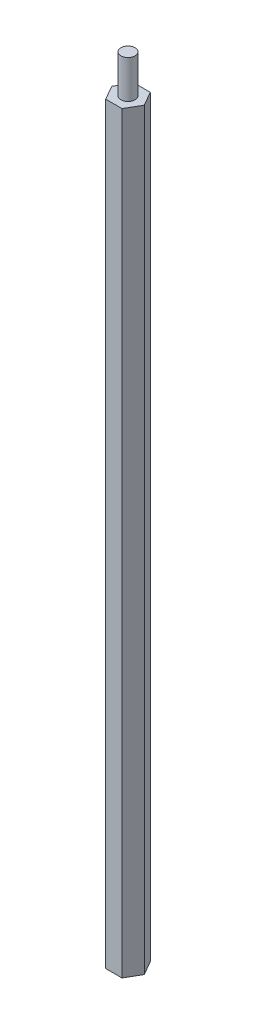
ISO-10303-21;
HEADER;
FILE_DESCRIPTION(('STEP AP214'),'2;1');
FILE_NAME('part.step','',(''),(''),'','','');
FILE_SCHEMA(('AUTOMOTIVE_DESIGN { 1 0 10303 214 1 1 1 1 }'));
ENDSEC;
DATA;
#1=APPLICATION_CONTEXT('core data for automotive mechanical design processes');
#2=APPLICATION_PROTOCOL_DEFINITION('international standard','automotive_design',2000,#1);
#3=PRODUCT_CONTEXT('',#1,'mechanical');
#4=PRODUCT('Part','Part','',(#3));
#5=PRODUCT_RELATED_PRODUCT_CATEGORY('part','',(#4));
#6=PRODUCT_DEFINITION_FORMATION('','',#4);
#7=PRODUCT_DEFINITION_CONTEXT('part definition',#1,'design');
#8=PRODUCT_DEFINITION('design','',#6,#7);
#9=PRODUCT_DEFINITION_SHAPE('','',#8);
#10=(LENGTH_UNIT() NAMED_UNIT(*) SI_UNIT(.MILLI.,.METRE.));
#11=(NAMED_UNIT(*) PLANE_ANGLE_UNIT() SI_UNIT($,.RADIAN.));
#12=(NAMED_UNIT(*) SI_UNIT($,.STERADIAN.) SOLID_ANGLE_UNIT());
#13=UNCERTAINTY_MEASURE_WITH_UNIT(LENGTH_MEASURE(1.E-05),#10,'distance_accuracy_value','');
#14=(GEOMETRIC_REPRESENTATION_CONTEXT(3) GLOBAL_UNCERTAINTY_ASSIGNED_CONTEXT((#13)) GLOBAL_UNIT_ASSIGNED_CONTEXT((#10,
#11,#12)) REPRESENTATION_CONTEXT('',''));
#15=CARTESIAN_POINT('',(0.,0.,0.));
#16=DIRECTION('',(0.,0.,1.));
#17=DIRECTION('',(1.,0.,0.));
#18=AXIS2_PLACEMENT_3D('',#15,#16,#17);
#19=CARTESIAN_POINT('',(-1.73205080756888,160.,-3.));
#20=DIRECTION('',(0.866025403784439,0.,0.5));
#21=DIRECTION('',(0.5,0.,-0.866025403784439));
#22=AXIS2_PLACEMENT_3D('',#19,#20,#21);
#23=PLANE('',#22);
#24=DIRECTION('',(-0.5,0.,0.866025403784439));
#25=VECTOR('',#24,1.);
#26=CARTESIAN_POINT('',(-1.73205080756888,0.,-3.));
#27=LINE('',#26,#25);
#28=CARTESIAN_POINT('',(-1.73205080756888,0.,-3.));
#29=VERTEX_POINT('',#28);
#30=CARTESIAN_POINT('',(-3.46410161513775,0.,0.));
#31=VERTEX_POINT('',#30);
#32=EDGE_CURVE('E123',#29,#31,#27,.T.);
#33=ORIENTED_EDGE('',*,*,#32,.T.);
#34=DIRECTION('',(0.,-1.,0.));
#35=VECTOR('',#34,1.);
#36=CARTESIAN_POINT('',(-3.46410161513775,160.,0.));
#37=LINE('',#36,#35);
#38=CARTESIAN_POINT('',(-3.46410161513775,160.,0.));
#39=VERTEX_POINT('',#38);
#40=EDGE_CURVE('E40',#39,#31,#37,.T.);
#41=ORIENTED_EDGE('',*,*,#40,.F.);
#42=DIRECTION('',(-0.5,0.,0.866025403784439));
#43=VECTOR('',#42,1.);
#44=CARTESIAN_POINT('',(-1.73205080756888,160.,-3.));
#45=LINE('',#44,#43);
#46=CARTESIAN_POINT('',(-1.73205080756888,160.,-3.));
#47=VERTEX_POINT('',#46);
#48=EDGE_CURVE('E134',#47,#39,#45,.T.);
#49=ORIENTED_EDGE('',*,*,#48,.F.);
#50=DIRECTION('',(0.,-1.,0.));
#51=VECTOR('',#50,1.);
#52=CARTESIAN_POINT('',(-1.73205080756888,160.,-3.));
#53=LINE('',#52,#51);
#54=EDGE_CURVE('E119',#47,#29,#53,.T.);
#55=ORIENTED_EDGE('',*,*,#54,.T.);
#56=EDGE_LOOP('',(#33,#41,#49,#55));
#57=FACE_BOUND('',#56,.T.);
#58=ADVANCED_FACE('F37',(#57),#23,.F.);
#59=CARTESIAN_POINT('',(-3.46410161513775,160.,0.));
#60=DIRECTION('',(0.866025403784439,0.,-0.5));
#61=DIRECTION('',(-0.5,0.,-0.866025403784439));
#62=AXIS2_PLACEMENT_3D('',#59,#60,#61);
#63=PLANE('',#62);
#64=DIRECTION('',(0.5,0.,0.866025403784439));
#65=VECTOR('',#64,1.);
#66=CARTESIAN_POINT('',(-3.46410161513775,0.,0.));
#67=LINE('',#66,#65);
#68=CARTESIAN_POINT('',(-1.73205080756888,0.,3.));
#69=VERTEX_POINT('',#68);
#70=EDGE_CURVE('E126',#31,#69,#67,.T.);
#71=ORIENTED_EDGE('',*,*,#70,.T.);
#72=DIRECTION('',(0.,-1.,0.));
#73=VECTOR('',#72,1.);
#74=CARTESIAN_POINT('',(-1.73205080756888,160.,3.));
#75=LINE('',#74,#73);
#76=CARTESIAN_POINT('',(-1.73205080756888,160.,3.));
#77=VERTEX_POINT('',#76);
#78=EDGE_CURVE('E137',#77,#69,#75,.T.);
#79=ORIENTED_EDGE('',*,*,#78,.F.);
#80=DIRECTION('',(0.5,0.,0.866025403784439));
#81=VECTOR('',#80,1.);
#82=CARTESIAN_POINT('',(-3.46410161513775,160.,0.));
#83=LINE('',#82,#81);
#84=EDGE_CURVE('E92',#39,#77,#83,.T.);
#85=ORIENTED_EDGE('',*,*,#84,.F.);
#86=ORIENTED_EDGE('',*,*,#40,.T.);
#87=EDGE_LOOP('',(#71,#79,#85,#86));
#88=FACE_BOUND('',#87,.T.);
#89=ADVANCED_FACE('F142',(#88),#63,.F.);
#90=CARTESIAN_POINT('',(-1.73205080756888,160.,3.));
#91=DIRECTION('',(0.,0.,-1.));
#92=DIRECTION('',(-1.,0.,0.));
#93=AXIS2_PLACEMENT_3D('',#90,#91,#92);
#94=PLANE('',#93);
#95=DIRECTION('',(1.,0.,0.));
#96=VECTOR('',#95,1.);
#97=CARTESIAN_POINT('',(-1.73205080756888,0.,3.));
#98=LINE('',#97,#96);
#99=CARTESIAN_POINT('',(1.73205080756888,0.,3.));
#100=VERTEX_POINT('',#99);
#101=EDGE_CURVE('E129',#69,#100,#98,.T.);
#102=ORIENTED_EDGE('',*,*,#101,.T.);
#103=DIRECTION('',(0.,-1.,0.));
#104=VECTOR('',#103,1.);
#105=CARTESIAN_POINT('',(1.73205080756888,160.,3.));
#106=LINE('',#105,#104);
#107=CARTESIAN_POINT('',(1.73205080756888,160.,3.));
#108=VERTEX_POINT('',#107);
#109=EDGE_CURVE('E114',#108,#100,#106,.T.);
#110=ORIENTED_EDGE('',*,*,#109,.F.);
#111=DIRECTION('',(1.,0.,0.));
#112=VECTOR('',#111,1.);
#113=CARTESIAN_POINT('',(-1.73205080756888,160.,3.));
#114=LINE('',#113,#112);
#115=EDGE_CURVE('E105',#77,#108,#114,.T.);
#116=ORIENTED_EDGE('',*,*,#115,.F.);
#117=ORIENTED_EDGE('',*,*,#78,.T.);
#118=EDGE_LOOP('',(#102,#110,#116,#117));
#119=FACE_BOUND('',#118,.T.);
#120=ADVANCED_FACE('F148',(#119),#94,.F.);
#121=CARTESIAN_POINT('',(1.73205080756888,160.,3.));
#122=DIRECTION('',(-0.866025403784439,0.,-0.5));
#123=DIRECTION('',(-0.5,0.,0.866025403784439));
#124=AXIS2_PLACEMENT_3D('',#121,#122,#123);
#125=PLANE('',#124);
#126=DIRECTION('',(0.5,0.,-0.866025403784439));
#127=VECTOR('',#126,1.);
#128=CARTESIAN_POINT('',(1.73205080756888,0.,3.));
#129=LINE('',#128,#127);
#130=CARTESIAN_POINT('',(3.46410161513775,0.,0.));
#131=VERTEX_POINT('',#130);
#132=EDGE_CURVE('E113',#100,#131,#129,.T.);
#133=ORIENTED_EDGE('',*,*,#132,.T.);
#134=DIRECTION('',(0.,-1.,0.));
#135=VECTOR('',#134,1.);
#136=CARTESIAN_POINT('',(3.46410161513775,160.,0.));
#137=LINE('',#136,#135);
#138=CARTESIAN_POINT('',(3.46410161513775,160.,0.));
#139=VERTEX_POINT('',#138);
#140=EDGE_CURVE('E110',#139,#131,#137,.T.);
#141=ORIENTED_EDGE('',*,*,#140,.F.);
#142=DIRECTION('',(0.5,0.,-0.866025403784439));
#143=VECTOR('',#142,1.);
#144=CARTESIAN_POINT('',(1.73205080756888,160.,3.));
#145=LINE('',#144,#143);
#146=EDGE_CURVE('E99',#108,#139,#145,.T.);
#147=ORIENTED_EDGE('',*,*,#146,.F.);
#148=ORIENTED_EDGE('',*,*,#109,.T.);
#149=EDGE_LOOP('',(#133,#141,#147,#148));
#150=FACE_BOUND('',#149,.T.);
#151=ADVANCED_FACE('F111',(#150),#125,.F.);
#152=CARTESIAN_POINT('',(3.46410161513775,160.,0.));
#153=DIRECTION('',(-0.866025403784439,0.,0.5));
#154=DIRECTION('',(0.5,0.,0.866025403784439));
#155=AXIS2_PLACEMENT_3D('',#152,#153,#154);
#156=PLANE('',#155);
#157=DIRECTION('',(-0.5,0.,-0.866025403784439));
#158=VECTOR('',#157,1.);
#159=CARTESIAN_POINT('',(3.46410161513775,0.,0.));
#160=LINE('',#159,#158);
#161=CARTESIAN_POINT('',(1.73205080756888,0.,-3.));
#162=VERTEX_POINT('',#161);
#163=EDGE_CURVE('E77',#131,#162,#160,.T.);
#164=ORIENTED_EDGE('',*,*,#163,.T.);
#165=DIRECTION('',(0.,-1.,0.));
#166=VECTOR('',#165,1.);
#167=CARTESIAN_POINT('',(1.73205080756888,160.,-3.));
#168=LINE('',#167,#166);
#169=CARTESIAN_POINT('',(1.73205080756888,160.,-3.));
#170=VERTEX_POINT('',#169);
#171=EDGE_CURVE('E115',#170,#162,#168,.T.);
#172=ORIENTED_EDGE('',*,*,#171,.F.);
#173=DIRECTION('',(-0.5,0.,-0.866025403784439));
#174=VECTOR('',#173,1.);
#175=CARTESIAN_POINT('',(3.46410161513775,160.,0.));
#176=LINE('',#175,#174);
#177=EDGE_CURVE('E103',#139,#170,#176,.T.);
#178=ORIENTED_EDGE('',*,*,#177,.F.);
#179=ORIENTED_EDGE('',*,*,#140,.T.);
#180=EDGE_LOOP('',(#164,#172,#178,#179));
#181=FACE_BOUND('',#180,.T.);
#182=ADVANCED_FACE('F117',(#181),#156,.F.);
#183=CARTESIAN_POINT('',(1.73205080756888,160.,-3.));
#184=DIRECTION('',(0.,0.,1.));
#185=DIRECTION('',(1.,0.,0.));
#186=AXIS2_PLACEMENT_3D('',#183,#184,#185);
#187=PLANE('',#186);
#188=DIRECTION('',(-1.,0.,0.));
#189=VECTOR('',#188,1.);
#190=CARTESIAN_POINT('',(1.73205080756888,0.,-3.));
#191=LINE('',#190,#189);
#192=EDGE_CURVE('E83',#162,#29,#191,.T.);
#193=ORIENTED_EDGE('',*,*,#192,.T.);
#194=ORIENTED_EDGE('',*,*,#54,.F.);
#195=DIRECTION('',(-1.,0.,0.));
#196=VECTOR('',#195,1.);
#197=CARTESIAN_POINT('',(1.73205080756888,160.,-3.));
#198=LINE('',#197,#196);
#199=EDGE_CURVE('E54',#170,#47,#198,.T.);
#200=ORIENTED_EDGE('',*,*,#199,.F.);
#201=ORIENTED_EDGE('',*,*,#171,.T.);
#202=EDGE_LOOP('',(#193,#194,#200,#201));
#203=FACE_BOUND('',#202,.T.);
#204=ADVANCED_FACE('F179',(#203),#187,.F.);
#205=CARTESIAN_POINT('',(0.,160.,0.));
#206=DIRECTION('',(0.,1.,0.));
#207=DIRECTION('',(0.,0.,1.));
#208=AXIS2_PLACEMENT_3D('',#205,#206,#207);
#209=PLANE('',#208);
#210=CARTESIAN_POINT('',(0.,160.,0.));
#211=DIRECTION('',(0.,1.,0.));
#212=DIRECTION('',(0.,0.,1.));
#213=AXIS2_PLACEMENT_3D('',#210,#211,#212);
#214=CIRCLE('',#213,1.5);
#215=CARTESIAN_POINT('',(0.,160.,1.5));
#216=VERTEX_POINT('',#215);
#217=EDGE_CURVE('E11',#216,#216,#214,.T.);
#218=ORIENTED_EDGE('',*,*,#217,.F.);
#219=EDGE_LOOP('',(#218));
#220=FACE_BOUND('',#219,.T.);
#221=ORIENTED_EDGE('',*,*,#48,.T.);
#222=ORIENTED_EDGE('',*,*,#84,.T.);
#223=ORIENTED_EDGE('',*,*,#115,.T.);
#224=ORIENTED_EDGE('',*,*,#146,.T.);
#225=ORIENTED_EDGE('',*,*,#177,.T.);
#226=ORIENTED_EDGE('',*,*,#199,.T.);
#227=EDGE_LOOP('',(#221,#222,#223,#224,#225,#226));
#228=FACE_BOUND('',#227,.T.);
#229=ADVANCED_FACE('F101',(#220,#228),#209,.T.);
#230=CARTESIAN_POINT('',(0.,0.,0.));
#231=DIRECTION('',(0.,1.,0.));
#232=DIRECTION('',(0.,0.,1.));
#233=AXIS2_PLACEMENT_3D('',#230,#231,#232);
#234=PLANE('',#233);
#235=CARTESIAN_POINT('',(0.,0.,0.));
#236=DIRECTION('',(0.,-1.,0.));
#237=DIRECTION('',(0.,0.,-1.));
#238=AXIS2_PLACEMENT_3D('',#235,#236,#237);
#239=CIRCLE('',#238,1.5);
#240=CARTESIAN_POINT('',(0.,0.,-1.5));
#241=VERTEX_POINT('',#240);
#242=EDGE_CURVE('E155',#241,#241,#239,.T.);
#243=ORIENTED_EDGE('',*,*,#242,.F.);
#244=EDGE_LOOP('',(#243));
#245=FACE_BOUND('',#244,.T.);
#246=ORIENTED_EDGE('',*,*,#32,.F.);
#247=ORIENTED_EDGE('',*,*,#192,.F.);
#248=ORIENTED_EDGE('',*,*,#163,.F.);
#249=ORIENTED_EDGE('',*,*,#132,.F.);
#250=ORIENTED_EDGE('',*,*,#101,.F.);
#251=ORIENTED_EDGE('',*,*,#70,.F.);
#252=EDGE_LOOP('',(#246,#247,#248,#249,#250,#251));
#253=FACE_BOUND('',#252,.T.);
#254=ADVANCED_FACE('F147',(#245,#253),#234,.F.);
#255=CARTESIAN_POINT('',(0.,168.091605470966,0.));
#256=DIRECTION('',(0.,-1.,0.));
#257=DIRECTION('',(0.,0.,-1.));
#258=AXIS2_PLACEMENT_3D('',#255,#256,#257);
#259=CYLINDRICAL_SURFACE('',#258,1.5);
#260=CARTESIAN_POINT('',(0.,168.091605470966,0.));
#261=DIRECTION('',(0.,1.,0.));
#262=DIRECTION('',(0.,0.,1.));
#263=AXIS2_PLACEMENT_3D('',#260,#261,#262);
#264=CIRCLE('',#263,1.5);
#265=CARTESIAN_POINT('',(0.,168.091605470966,1.5));
#266=VERTEX_POINT('',#265);
#267=EDGE_CURVE('E127',#266,#266,#264,.T.);
#268=ORIENTED_EDGE('',*,*,#267,.F.);
#269=EDGE_LOOP('',(#268));
#270=FACE_BOUND('',#269,.T.);
#271=ORIENTED_EDGE('',*,*,#217,.T.);
#272=EDGE_LOOP('',(#271));
#273=FACE_BOUND('',#272,.T.);
#274=ADVANCED_FACE('F171',(#270,#273),#259,.T.);
#275=CARTESIAN_POINT('',(0.,168.091605470966,0.));
#276=DIRECTION('',(0.,1.,0.));
#277=DIRECTION('',(0.,0.,1.));
#278=AXIS2_PLACEMENT_3D('',#275,#276,#277);
#279=PLANE('',#278);
#280=ORIENTED_EDGE('',*,*,#267,.T.);
#281=EDGE_LOOP('',(#280));
#282=FACE_BOUND('',#281,.T.);
#283=ADVANCED_FACE('F166',(#282),#279,.T.);
#284=CARTESIAN_POINT('',(0.,4.,0.));
#285=DIRECTION('',(0.,-1.,0.));
#286=DIRECTION('',(0.,0.,-1.));
#287=AXIS2_PLACEMENT_3D('',#284,#285,#286);
#288=CYLINDRICAL_SURFACE('',#287,1.5);
#289=CARTESIAN_POINT('',(0.,4.,0.));
#290=DIRECTION('',(0.,-1.,0.));
#291=DIRECTION('',(0.,0.,-1.));
#292=AXIS2_PLACEMENT_3D('',#289,#290,#291);
#293=CIRCLE('',#292,1.5);
#294=CARTESIAN_POINT('',(0.,4.,-1.5));
#295=VERTEX_POINT('',#294);
#296=EDGE_CURVE('E154',#295,#295,#293,.T.);
#297=ORIENTED_EDGE('',*,*,#296,.F.);
#298=EDGE_LOOP('',(#297));
#299=FACE_BOUND('',#298,.T.);
#300=ORIENTED_EDGE('',*,*,#242,.T.);
#301=EDGE_LOOP('',(#300));
#302=FACE_BOUND('',#301,.T.);
#303=ADVANCED_FACE('F163',(#299,#302),#288,.F.);
#304=CARTESIAN_POINT('',(0.,4.,0.));
#305=DIRECTION('',(0.,-1.,0.));
#306=DIRECTION('',(0.,0.,-1.));
#307=AXIS2_PLACEMENT_3D('',#304,#305,#306);
#308=PLANE('',#307);
#309=ORIENTED_EDGE('',*,*,#296,.T.);
#310=EDGE_LOOP('',(#309));
#311=FACE_BOUND('',#310,.T.);
#312=ADVANCED_FACE('F161',(#311),#308,.T.);
#313=CLOSED_SHELL('',(#58,#89,#120,#151,#182,#204,#229,#254,#274,#283,#303,#312));
#314=MANIFOLD_SOLID_BREP('B2',#313);
#315=ADVANCED_BREP_SHAPE_REPRESENTATION('',(#18,#314),#14);
#316=SHAPE_DEFINITION_REPRESENTATION(#9,#315);
ENDSEC;
END-ISO-10303-21;
